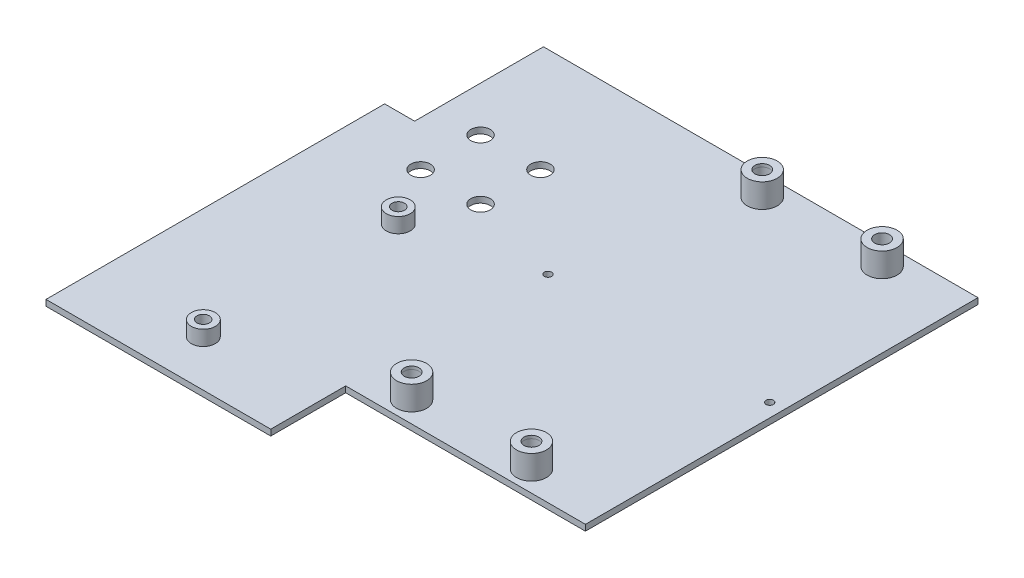
ISO-10303-21;
HEADER;
FILE_DESCRIPTION(('STEP AP214'),'2;1');
FILE_NAME('part.step','',(''),(''),'','','');
FILE_SCHEMA(('AUTOMOTIVE_DESIGN { 1 0 10303 214 1 1 1 1 }'));
ENDSEC;
DATA;
#1=APPLICATION_CONTEXT('core data for automotive mechanical design processes');
#2=APPLICATION_PROTOCOL_DEFINITION('international standard','automotive_design',2000,#1);
#3=PRODUCT_CONTEXT('',#1,'mechanical');
#4=PRODUCT('Part','Part','',(#3));
#5=PRODUCT_RELATED_PRODUCT_CATEGORY('part','',(#4));
#6=PRODUCT_DEFINITION_FORMATION('','',#4);
#7=PRODUCT_DEFINITION_CONTEXT('part definition',#1,'design');
#8=PRODUCT_DEFINITION('design','',#6,#7);
#9=PRODUCT_DEFINITION_SHAPE('','',#8);
#10=(LENGTH_UNIT() NAMED_UNIT(*) SI_UNIT(.MILLI.,.METRE.));
#11=(NAMED_UNIT(*) PLANE_ANGLE_UNIT() SI_UNIT($,.RADIAN.));
#12=(NAMED_UNIT(*) SI_UNIT($,.STERADIAN.) SOLID_ANGLE_UNIT());
#13=UNCERTAINTY_MEASURE_WITH_UNIT(LENGTH_MEASURE(1.E-05),#10,'distance_accuracy_value','');
#14=(GEOMETRIC_REPRESENTATION_CONTEXT(3) GLOBAL_UNCERTAINTY_ASSIGNED_CONTEXT((#13)) GLOBAL_UNIT_ASSIGNED_CONTEXT((#10,
#11,#12)) REPRESENTATION_CONTEXT('',''));
#15=CARTESIAN_POINT('',(0.,0.,0.));
#16=DIRECTION('',(0.,0.,1.));
#17=DIRECTION('',(1.,0.,0.));
#18=AXIS2_PLACEMENT_3D('',#15,#16,#17);
#19=CARTESIAN_POINT('',(90.,2.,-50.));
#20=DIRECTION('',(1.,0.,0.));
#21=DIRECTION('',(0.,0.,-1.));
#22=AXIS2_PLACEMENT_3D('',#19,#20,#21);
#23=PLANE('',#22);
#24=DIRECTION('',(0.,0.,1.));
#25=VECTOR('',#24,1.);
#26=CARTESIAN_POINT('',(90.,2.,-50.));
#27=LINE('',#26,#25);
#28=CARTESIAN_POINT('',(90.,2.,-66.));
#29=VERTEX_POINT('',#28);
#30=CARTESIAN_POINT('',(90.,2.,65.));
#31=VERTEX_POINT('',#30);
#32=EDGE_CURVE('E122',#29,#31,#27,.T.);
#33=ORIENTED_EDGE('',*,*,#32,.T.);
#34=DIRECTION('',(0.,-1.,0.));
#35=VECTOR('',#34,1.);
#36=CARTESIAN_POINT('',(90.,47.3659563319489,65.));
#37=LINE('',#36,#35);
#38=CARTESIAN_POINT('',(90.,0.,65.));
#39=VERTEX_POINT('',#38);
#40=EDGE_CURVE('E39',#31,#39,#37,.T.);
#41=ORIENTED_EDGE('',*,*,#40,.T.);
#42=DIRECTION('',(0.,0.,1.));
#43=VECTOR('',#42,1.);
#44=CARTESIAN_POINT('',(90.,0.,-50.));
#45=LINE('',#44,#43);
#46=CARTESIAN_POINT('',(90.,0.,-66.));
#47=VERTEX_POINT('',#46);
#48=EDGE_CURVE('E97',#47,#39,#45,.T.);
#49=ORIENTED_EDGE('',*,*,#48,.F.);
#50=DIRECTION('',(0.,-1.,0.));
#51=VECTOR('',#50,1.);
#52=CARTESIAN_POINT('',(90.,2.,-66.));
#53=LINE('',#52,#51);
#54=EDGE_CURVE('E102',#29,#47,#53,.T.);
#55=ORIENTED_EDGE('',*,*,#54,.F.);
#56=EDGE_LOOP('',(#33,#41,#49,#55));
#57=FACE_BOUND('',#56,.T.);
#58=ADVANCED_FACE('F20',(#57),#23,.T.);
#59=CARTESIAN_POINT('',(65.,27.5440719376556,58.));
#60=DIRECTION('',(0.,-1.,0.));
#61=DIRECTION('',(0.,0.,-1.));
#62=AXIS2_PLACEMENT_3D('',#59,#60,#61);
#63=CYLINDRICAL_SURFACE('',#62,2.4585);
#64=CARTESIAN_POINT('',(65.,10.,58.));
#65=DIRECTION('',(0.,-1.,0.));
#66=DIRECTION('',(0.,0.,-1.));
#67=AXIS2_PLACEMENT_3D('',#64,#65,#66);
#68=CIRCLE('',#67,2.4585);
#69=CARTESIAN_POINT('',(65.,10.,55.5415));
#70=VERTEX_POINT('',#69);
#71=EDGE_CURVE('E133',#70,#70,#68,.F.);
#72=ORIENTED_EDGE('',*,*,#71,.T.);
#73=EDGE_LOOP('',(#72));
#74=FACE_BOUND('',#73,.T.);
#75=CARTESIAN_POINT('',(65.,9.,58.));
#76=DIRECTION('',(0.,-1.,0.));
#77=DIRECTION('',(0.,0.,-1.));
#78=AXIS2_PLACEMENT_3D('',#75,#76,#77);
#79=CIRCLE('',#78,2.4585);
#80=CARTESIAN_POINT('',(65.,9.,55.5415));
#81=VERTEX_POINT('',#80);
#82=EDGE_CURVE('E197',#81,#81,#79,.T.);
#83=ORIENTED_EDGE('',*,*,#82,.T.);
#84=EDGE_LOOP('',(#83));
#85=FACE_BOUND('',#84,.T.);
#86=ADVANCED_FACE('F374',(#74,#85),#63,.F.);
#87=CARTESIAN_POINT('',(25.,27.5440719376556,58.));
#88=DIRECTION('',(0.,-1.,0.));
#89=DIRECTION('',(0.,0.,-1.));
#90=AXIS2_PLACEMENT_3D('',#87,#88,#89);
#91=CYLINDRICAL_SURFACE('',#90,2.4585);
#92=CARTESIAN_POINT('',(25.,10.,58.));
#93=DIRECTION('',(0.,-1.,0.));
#94=DIRECTION('',(0.,0.,-1.));
#95=AXIS2_PLACEMENT_3D('',#92,#93,#94);
#96=CIRCLE('',#95,2.4585);
#97=CARTESIAN_POINT('',(25.,10.,55.5415));
#98=VERTEX_POINT('',#97);
#99=EDGE_CURVE('E171',#98,#98,#96,.F.);
#100=ORIENTED_EDGE('',*,*,#99,.T.);
#101=EDGE_LOOP('',(#100));
#102=FACE_BOUND('',#101,.T.);
#103=CARTESIAN_POINT('',(25.,9.,58.));
#104=DIRECTION('',(0.,-1.,0.));
#105=DIRECTION('',(0.,0.,-1.));
#106=AXIS2_PLACEMENT_3D('',#103,#104,#105);
#107=CIRCLE('',#106,2.4585);
#108=CARTESIAN_POINT('',(25.,9.,55.5415));
#109=VERTEX_POINT('',#108);
#110=EDGE_CURVE('E167',#109,#109,#107,.T.);
#111=ORIENTED_EDGE('',*,*,#110,.T.);
#112=EDGE_LOOP('',(#111));
#113=FACE_BOUND('',#112,.T.);
#114=ADVANCED_FACE('F379',(#102,#113),#91,.F.);
#115=CARTESIAN_POINT('',(65.,27.5440719376556,-59.));
#116=DIRECTION('',(0.,-1.,0.));
#117=DIRECTION('',(0.,0.,-1.));
#118=AXIS2_PLACEMENT_3D('',#115,#116,#117);
#119=CYLINDRICAL_SURFACE('',#118,2.4585);
#120=CARTESIAN_POINT('',(65.,0.,-59.));
#121=DIRECTION('',(0.,-1.,0.));
#122=DIRECTION('',(0.,0.,-1.));
#123=AXIS2_PLACEMENT_3D('',#120,#121,#122);
#124=CIRCLE('',#123,2.4585);
#125=CARTESIAN_POINT('',(65.,0.,-61.4585));
#126=VERTEX_POINT('',#125);
#127=EDGE_CURVE('E142',#126,#126,#124,.F.);
#128=ORIENTED_EDGE('',*,*,#127,.F.);
#129=EDGE_LOOP('',(#128));
#130=FACE_BOUND('',#129,.T.);
#131=CARTESIAN_POINT('',(65.,1.,-59.));
#132=DIRECTION('',(0.,1.,0.));
#133=DIRECTION('',(0.,0.,-1.));
#134=AXIS2_PLACEMENT_3D('',#131,#132,#133);
#135=CIRCLE('',#134,2.4585);
#136=CARTESIAN_POINT('',(65.,1.,-61.4585));
#137=VERTEX_POINT('',#136);
#138=EDGE_CURVE('E161',#137,#137,#135,.T.);
#139=ORIENTED_EDGE('',*,*,#138,.T.);
#140=EDGE_LOOP('',(#139));
#141=FACE_BOUND('',#140,.T.);
#142=ADVANCED_FACE('F396',(#130,#141),#119,.F.);
#143=CARTESIAN_POINT('',(25.,27.5440719376556,-59.));
#144=DIRECTION('',(0.,-1.,0.));
#145=DIRECTION('',(0.,0.,-1.));
#146=AXIS2_PLACEMENT_3D('',#143,#144,#145);
#147=CYLINDRICAL_SURFACE('',#146,2.4585);
#148=CARTESIAN_POINT('',(25.,10.,-59.));
#149=DIRECTION('',(0.,-1.,0.));
#150=DIRECTION('',(0.,0.,-1.));
#151=AXIS2_PLACEMENT_3D('',#148,#149,#150);
#152=CIRCLE('',#151,2.4585);
#153=CARTESIAN_POINT('',(25.,10.,-61.4585));
#154=VERTEX_POINT('',#153);
#155=EDGE_CURVE('E137',#154,#154,#152,.F.);
#156=ORIENTED_EDGE('',*,*,#155,.T.);
#157=EDGE_LOOP('',(#156));
#158=FACE_BOUND('',#157,.T.);
#159=CARTESIAN_POINT('',(25.,9.,-59.));
#160=DIRECTION('',(0.,-1.,0.));
#161=DIRECTION('',(0.,0.,-1.));
#162=AXIS2_PLACEMENT_3D('',#159,#160,#161);
#163=CIRCLE('',#162,2.4585);
#164=CARTESIAN_POINT('',(25.,9.,-61.4585));
#165=VERTEX_POINT('',#164);
#166=EDGE_CURVE('E157',#165,#165,#163,.T.);
#167=ORIENTED_EDGE('',*,*,#166,.T.);
#168=EDGE_LOOP('',(#167));
#169=FACE_BOUND('',#168,.T.);
#170=ADVANCED_FACE('F391',(#158,#169),#147,.F.);
#171=CARTESIAN_POINT('',(-28.,47.1871181512282,74.55));
#172=DIRECTION('',(0.,-1.,0.));
#173=DIRECTION('',(0.,0.,-1.));
#174=AXIS2_PLACEMENT_3D('',#171,#172,#173);
#175=CYLINDRICAL_SURFACE('',#174,2.067);
#176=CARTESIAN_POINT('',(-28.,0.,74.55));
#177=DIRECTION('',(0.,-1.,0.));
#178=DIRECTION('',(0.,0.,-1.));
#179=AXIS2_PLACEMENT_3D('',#176,#177,#178);
#180=CIRCLE('',#179,2.067);
#181=CARTESIAN_POINT('',(-28.,0.,72.483));
#182=VERTEX_POINT('',#181);
#183=EDGE_CURVE('E262',#182,#182,#180,.F.);
#184=ORIENTED_EDGE('',*,*,#183,.F.);
#185=EDGE_LOOP('',(#184));
#186=FACE_BOUND('',#185,.T.);
#187=CARTESIAN_POINT('',(-28.,7.,74.55));
#188=DIRECTION('',(0.,-1.,0.));
#189=DIRECTION('',(0.,0.,-1.));
#190=AXIS2_PLACEMENT_3D('',#187,#188,#189);
#191=CIRCLE('',#190,2.067);
#192=CARTESIAN_POINT('',(-28.,7.,72.483));
#193=VERTEX_POINT('',#192);
#194=EDGE_CURVE('E266',#193,#193,#191,.F.);
#195=ORIENTED_EDGE('',*,*,#194,.T.);
#196=EDGE_LOOP('',(#195));
#197=FACE_BOUND('',#196,.T.);
#198=ADVANCED_FACE('F454',(#186,#197),#175,.F.);
#199=CARTESIAN_POINT('',(0.,0.,0.));
#200=DIRECTION('',(0.,-1.,0.));
#201=DIRECTION('',(0.,0.,-1.));
#202=AXIS2_PLACEMENT_3D('',#199,#200,#201);
#203=PLANE('',#202);
#204=DIRECTION('',(0.,0.,-1.));
#205=VECTOR('',#204,1.);
#206=CARTESIAN_POINT('',(10.,0.,90.));
#207=LINE('',#206,#205);
#208=CARTESIAN_POINT('',(10.,0.,90.));
#209=VERTEX_POINT('',#208);
#210=CARTESIAN_POINT('',(10.,0.,65.));
#211=VERTEX_POINT('',#210);
#212=EDGE_CURVE('E346',#209,#211,#207,.T.);
#213=ORIENTED_EDGE('',*,*,#212,.F.);
#214=DIRECTION('',(-1.,0.,0.));
#215=VECTOR('',#214,1.);
#216=CARTESIAN_POINT('',(50.,0.,90.));
#217=LINE('',#216,#215);
#218=CARTESIAN_POINT('',(-65.,0.,90.));
#219=VERTEX_POINT('',#218);
#220=EDGE_CURVE('E111',#209,#219,#217,.T.);
#221=ORIENTED_EDGE('',*,*,#220,.T.);
#222=DIRECTION('',(0.,0.,1.));
#223=VECTOR('',#222,1.);
#224=CARTESIAN_POINT('',(-65.,0.,50.));
#225=LINE('',#224,#223);
#226=CARTESIAN_POINT('',(-65.,0.,-23.));
#227=VERTEX_POINT('',#226);
#228=EDGE_CURVE('E100',#219,#227,#225,.F.);
#229=ORIENTED_EDGE('',*,*,#228,.T.);
#230=DIRECTION('',(-1.,0.,0.));
#231=VECTOR('',#230,1.);
#232=CARTESIAN_POINT('',(-50.,0.,-23.));
#233=LINE('',#232,#231);
#234=CARTESIAN_POINT('',(-55.,0.,-23.));
#235=VERTEX_POINT('',#234);
#236=EDGE_CURVE('E221',#235,#227,#233,.T.);
#237=ORIENTED_EDGE('',*,*,#236,.F.);
#238=DIRECTION('',(0.,0.,-1.));
#239=VECTOR('',#238,1.);
#240=CARTESIAN_POINT('',(-55.,0.,-66.));
#241=LINE('',#240,#239);
#242=CARTESIAN_POINT('',(-55.,0.,-66.));
#243=VERTEX_POINT('',#242);
#244=EDGE_CURVE('E58',#235,#243,#241,.T.);
#245=ORIENTED_EDGE('',*,*,#244,.T.);
#246=DIRECTION('',(1.,0.,0.));
#247=VECTOR('',#246,1.);
#248=CARTESIAN_POINT('',(-50.,0.,-66.));
#249=LINE('',#248,#247);
#250=EDGE_CURVE('E91',#243,#47,#249,.T.);
#251=ORIENTED_EDGE('',*,*,#250,.T.);
#252=ORIENTED_EDGE('',*,*,#48,.T.);
#253=DIRECTION('',(1.,0.,0.));
#254=VECTOR('',#253,1.);
#255=CARTESIAN_POINT('',(10.,0.,65.));
#256=LINE('',#255,#254);
#257=EDGE_CURVE('E343',#211,#39,#256,.T.);
#258=ORIENTED_EDGE('',*,*,#257,.F.);
#259=EDGE_LOOP('',(#213,#221,#229,#237,#245,#251,#252,#258));
#260=FACE_BOUND('',#259,.T.);
#261=CARTESIAN_POINT('',(11.5,0.,-1.));
#262=DIRECTION('',(0.,-1.,0.));
#263=DIRECTION('',(0.,0.,-1.));
#264=AXIS2_PLACEMENT_3D('',#261,#262,#263);
#265=CIRCLE('',#264,1.2295);
#266=CARTESIAN_POINT('',(11.5,0.,-2.2295));
#267=VERTEX_POINT('',#266);
#268=EDGE_CURVE('E202',#267,#267,#265,.F.);
#269=ORIENTED_EDGE('',*,*,#268,.T.);
#270=EDGE_LOOP('',(#269));
#271=FACE_BOUND('',#270,.T.);
#272=CARTESIAN_POINT('',(85.5,0.,-1.));
#273=DIRECTION('',(0.,-1.,0.));
#274=DIRECTION('',(0.,0.,-1.));
#275=AXIS2_PLACEMENT_3D('',#272,#273,#274);
#276=CIRCLE('',#275,1.2295);
#277=CARTESIAN_POINT('',(85.5,0.,-2.2295));
#278=VERTEX_POINT('',#277);
#279=EDGE_CURVE('E210',#278,#278,#276,.F.);
#280=ORIENTED_EDGE('',*,*,#279,.T.);
#281=EDGE_LOOP('',(#280));
#282=FACE_BOUND('',#281,.T.);
#283=CARTESIAN_POINT('',(65.,0.,58.));
#284=DIRECTION('',(0.,-1.,0.));
#285=DIRECTION('',(0.,0.,-1.));
#286=AXIS2_PLACEMENT_3D('',#283,#284,#285);
#287=CIRCLE('',#286,2.4585);
#288=CARTESIAN_POINT('',(65.,0.,55.5415));
#289=VERTEX_POINT('',#288);
#290=EDGE_CURVE('E156',#289,#289,#287,.F.);
#291=ORIENTED_EDGE('',*,*,#290,.T.);
#292=EDGE_LOOP('',(#291));
#293=FACE_BOUND('',#292,.T.);
#294=CARTESIAN_POINT('',(25.,0.,58.));
#295=DIRECTION('',(0.,-1.,0.));
#296=DIRECTION('',(0.,0.,-1.));
#297=AXIS2_PLACEMENT_3D('',#294,#295,#296);
#298=CIRCLE('',#297,2.4585);
#299=CARTESIAN_POINT('',(25.,0.,55.5415));
#300=VERTEX_POINT('',#299);
#301=EDGE_CURVE('E153',#300,#300,#298,.F.);
#302=ORIENTED_EDGE('',*,*,#301,.T.);
#303=EDGE_LOOP('',(#302));
#304=FACE_BOUND('',#303,.T.);
#305=CARTESIAN_POINT('',(25.,0.,-59.));
#306=DIRECTION('',(0.,-1.,0.));
#307=DIRECTION('',(0.,0.,-1.));
#308=AXIS2_PLACEMENT_3D('',#305,#306,#307);
#309=CIRCLE('',#308,2.4585);
#310=CARTESIAN_POINT('',(25.,0.,-61.4585));
#311=VERTEX_POINT('',#310);
#312=EDGE_CURVE('E147',#311,#311,#309,.F.);
#313=ORIENTED_EDGE('',*,*,#312,.T.);
#314=EDGE_LOOP('',(#313));
#315=FACE_BOUND('',#314,.T.);
#316=ORIENTED_EDGE('',*,*,#127,.T.);
#317=EDGE_LOOP('',(#316));
#318=FACE_BOUND('',#317,.T.);
#319=ORIENTED_EDGE('',*,*,#183,.T.);
#320=EDGE_LOOP('',(#319));
#321=FACE_BOUND('',#320,.T.);
#322=CARTESIAN_POINT('',(-28.,0.,9.45));
#323=DIRECTION('',(0.,-1.,0.));
#324=DIRECTION('',(0.,0.,-1.));
#325=AXIS2_PLACEMENT_3D('',#322,#323,#324);
#326=CIRCLE('',#325,2.067);
#327=CARTESIAN_POINT('',(-28.,0.,7.383));
#328=VERTEX_POINT('',#327);
#329=EDGE_CURVE('E230',#328,#328,#326,.F.);
#330=ORIENTED_EDGE('',*,*,#329,.T.);
#331=EDGE_LOOP('',(#330));
#332=FACE_BOUND('',#331,.T.);
#333=CARTESIAN_POINT('',(-20.,0.,-30.));
#334=DIRECTION('',(0.,1.,0.));
#335=DIRECTION('',(1.,0.,0.));
#336=AXIS2_PLACEMENT_3D('',#333,#334,#335);
#337=CIRCLE('',#336,3.25);
#338=CARTESIAN_POINT('',(-16.75,0.,-30.));
#339=VERTEX_POINT('',#338);
#340=EDGE_CURVE('E225',#339,#339,#337,.T.);
#341=ORIENTED_EDGE('',*,*,#340,.T.);
#342=EDGE_LOOP('',(#341));
#343=FACE_BOUND('',#342,.T.);
#344=CARTESIAN_POINT('',(-40.,0.,-30.));
#345=DIRECTION('',(0.,1.,0.));
#346=DIRECTION('',(1.,0.,0.));
#347=AXIS2_PLACEMENT_3D('',#344,#345,#346);
#348=CIRCLE('',#347,3.25);
#349=CARTESIAN_POINT('',(-36.75,0.,-30.));
#350=VERTEX_POINT('',#349);
#351=EDGE_CURVE('E233',#350,#350,#348,.T.);
#352=ORIENTED_EDGE('',*,*,#351,.T.);
#353=EDGE_LOOP('',(#352));
#354=FACE_BOUND('',#353,.T.);
#355=CARTESIAN_POINT('',(-20.,0.,-10.));
#356=DIRECTION('',(0.,1.,0.));
#357=DIRECTION('',(1.,0.,0.));
#358=AXIS2_PLACEMENT_3D('',#355,#356,#357);
#359=CIRCLE('',#358,3.25);
#360=CARTESIAN_POINT('',(-16.75,0.,-10.));
#361=VERTEX_POINT('',#360);
#362=EDGE_CURVE('E234',#361,#361,#359,.T.);
#363=ORIENTED_EDGE('',*,*,#362,.T.);
#364=EDGE_LOOP('',(#363));
#365=FACE_BOUND('',#364,.T.);
#366=CARTESIAN_POINT('',(-40.,0.,-10.));
#367=DIRECTION('',(0.,1.,0.));
#368=DIRECTION('',(1.,0.,0.));
#369=AXIS2_PLACEMENT_3D('',#366,#367,#368);
#370=CIRCLE('',#369,3.25);
#371=CARTESIAN_POINT('',(-36.75,0.,-10.));
#372=VERTEX_POINT('',#371);
#373=EDGE_CURVE('E242',#372,#372,#370,.T.);
#374=ORIENTED_EDGE('',*,*,#373,.T.);
#375=EDGE_LOOP('',(#374));
#376=FACE_BOUND('',#375,.T.);
#377=ADVANCED_FACE('F93',(#260,#271,#282,#293,#304,#315,#318,#321,#332,#343,#354,#365,#376),
#203,.T.);
#378=CARTESIAN_POINT('',(-50.,2.,-66.));
#379=DIRECTION('',(0.,0.,-1.));
#380=DIRECTION('',(-1.,0.,0.));
#381=AXIS2_PLACEMENT_3D('',#378,#379,#380);
#382=PLANE('',#381);
#383=ORIENTED_EDGE('',*,*,#250,.F.);
#384=DIRECTION('',(0.,-1.,0.));
#385=VECTOR('',#384,1.);
#386=CARTESIAN_POINT('',(-55.,16.6979131098016,-66.));
#387=LINE('',#386,#385);
#388=CARTESIAN_POINT('',(-55.,2.,-66.));
#389=VERTEX_POINT('',#388);
#390=EDGE_CURVE('E188',#389,#243,#387,.T.);
#391=ORIENTED_EDGE('',*,*,#390,.F.);
#392=DIRECTION('',(1.,0.,0.));
#393=VECTOR('',#392,1.);
#394=CARTESIAN_POINT('',(-50.,2.,-66.));
#395=LINE('',#394,#393);
#396=EDGE_CURVE('E85',#389,#29,#395,.T.);
#397=ORIENTED_EDGE('',*,*,#396,.T.);
#398=ORIENTED_EDGE('',*,*,#54,.T.);
#399=EDGE_LOOP('',(#383,#391,#397,#398));
#400=FACE_BOUND('',#399,.T.);
#401=ADVANCED_FACE('F103',(#400),#382,.T.);
#402=CARTESIAN_POINT('',(0.,2.,0.));
#403=DIRECTION('',(0.,-1.,0.));
#404=DIRECTION('',(0.,0.,-1.));
#405=AXIS2_PLACEMENT_3D('',#402,#403,#404);
#406=PLANE('',#405);
#407=CARTESIAN_POINT('',(11.5,2.,-1.));
#408=DIRECTION('',(0.,-1.,0.));
#409=DIRECTION('',(0.,0.,-1.));
#410=AXIS2_PLACEMENT_3D('',#407,#408,#409);
#411=CIRCLE('',#410,1.2295);
#412=CARTESIAN_POINT('',(11.5,2.,-2.2295));
#413=VERTEX_POINT('',#412);
#414=EDGE_CURVE('E206',#413,#413,#411,.F.);
#415=ORIENTED_EDGE('',*,*,#414,.F.);
#416=EDGE_LOOP('',(#415));
#417=FACE_BOUND('',#416,.T.);
#418=CARTESIAN_POINT('',(85.5,2.,-1.));
#419=DIRECTION('',(0.,-1.,0.));
#420=DIRECTION('',(0.,0.,-1.));
#421=AXIS2_PLACEMENT_3D('',#418,#419,#420);
#422=CIRCLE('',#421,1.2295);
#423=CARTESIAN_POINT('',(85.5,2.,-2.2295));
#424=VERTEX_POINT('',#423);
#425=EDGE_CURVE('E214',#424,#424,#422,.F.);
#426=ORIENTED_EDGE('',*,*,#425,.F.);
#427=EDGE_LOOP('',(#426));
#428=FACE_BOUND('',#427,.T.);
#429=CARTESIAN_POINT('',(-27.9447256614999,2.,74.55));
#430=DIRECTION('',(0.,-1.,0.));
#431=DIRECTION('',(-1.,0.,0.));
#432=AXIS2_PLACEMENT_3D('',#429,#430,#431);
#433=CIRCLE('',#432,4.);
#434=CARTESIAN_POINT('',(-31.9447256614999,2.,74.55));
#435=VERTEX_POINT('',#434);
#436=EDGE_CURVE('E146',#435,#435,#433,.T.);
#437=ORIENTED_EDGE('',*,*,#436,.T.);
#438=EDGE_LOOP('',(#437));
#439=FACE_BOUND('',#438,.T.);
#440=CARTESIAN_POINT('',(-40.,2.,-10.));
#441=DIRECTION('',(0.,-1.,0.));
#442=DIRECTION('',(0.,0.,-1.));
#443=AXIS2_PLACEMENT_3D('',#440,#441,#442);
#444=CIRCLE('',#443,3.25);
#445=CARTESIAN_POINT('',(-40.,2.,-13.25));
#446=VERTEX_POINT('',#445);
#447=EDGE_CURVE('E24',#446,#446,#444,.F.);
#448=ORIENTED_EDGE('',*,*,#447,.F.);
#449=EDGE_LOOP('',(#448));
#450=FACE_BOUND('',#449,.T.);
#451=CARTESIAN_POINT('',(-20.,2.,-10.));
#452=DIRECTION('',(0.,-1.,0.));
#453=DIRECTION('',(0.,0.,-1.));
#454=AXIS2_PLACEMENT_3D('',#451,#452,#453);
#455=CIRCLE('',#454,3.25);
#456=CARTESIAN_POINT('',(-20.,2.,-13.25));
#457=VERTEX_POINT('',#456);
#458=EDGE_CURVE('E238',#457,#457,#455,.F.);
#459=ORIENTED_EDGE('',*,*,#458,.F.);
#460=EDGE_LOOP('',(#459));
#461=FACE_BOUND('',#460,.T.);
#462=CARTESIAN_POINT('',(-40.,2.,-30.));
#463=DIRECTION('',(0.,-1.,0.));
#464=DIRECTION('',(0.,0.,-1.));
#465=AXIS2_PLACEMENT_3D('',#462,#463,#464);
#466=CIRCLE('',#465,3.25);
#467=CARTESIAN_POINT('',(-40.,2.,-33.25));
#468=VERTEX_POINT('',#467);
#469=EDGE_CURVE('E239',#468,#468,#466,.F.);
#470=ORIENTED_EDGE('',*,*,#469,.F.);
#471=EDGE_LOOP('',(#470));
#472=FACE_BOUND('',#471,.T.);
#473=CARTESIAN_POINT('',(-20.,2.,-30.));
#474=DIRECTION('',(0.,-1.,0.));
#475=DIRECTION('',(0.,0.,-1.));
#476=AXIS2_PLACEMENT_3D('',#473,#474,#475);
#477=CIRCLE('',#476,3.25);
#478=CARTESIAN_POINT('',(-20.,2.,-33.25));
#479=VERTEX_POINT('',#478);
#480=EDGE_CURVE('E229',#479,#479,#477,.F.);
#481=ORIENTED_EDGE('',*,*,#480,.F.);
#482=EDGE_LOOP('',(#481));
#483=FACE_BOUND('',#482,.T.);
#484=CARTESIAN_POINT('',(-28.,2.,9.45));
#485=DIRECTION('',(0.,-1.,0.));
#486=DIRECTION('',(-1.,0.,0.));
#487=AXIS2_PLACEMENT_3D('',#484,#485,#486);
#488=CIRCLE('',#487,4.);
#489=CARTESIAN_POINT('',(-32.,2.,9.45));
#490=VERTEX_POINT('',#489);
#491=EDGE_CURVE('E269',#490,#490,#488,.T.);
#492=ORIENTED_EDGE('',*,*,#491,.T.);
#493=EDGE_LOOP('',(#492));
#494=FACE_BOUND('',#493,.T.);
#495=CARTESIAN_POINT('',(25.,2.,-59.));
#496=DIRECTION('',(0.,-1.,0.));
#497=DIRECTION('',(-1.,0.,0.));
#498=AXIS2_PLACEMENT_3D('',#495,#496,#497);
#499=CIRCLE('',#498,5.);
#500=CARTESIAN_POINT('',(20.,2.,-59.));
#501=VERTEX_POINT('',#500);
#502=EDGE_CURVE('E138',#501,#501,#499,.T.);
#503=ORIENTED_EDGE('',*,*,#502,.T.);
#504=EDGE_LOOP('',(#503));
#505=FACE_BOUND('',#504,.T.);
#506=CARTESIAN_POINT('',(65.,2.,-59.));
#507=DIRECTION('',(0.,-1.,0.));
#508=DIRECTION('',(-1.,0.,0.));
#509=AXIS2_PLACEMENT_3D('',#506,#507,#508);
#510=CIRCLE('',#509,5.);
#511=CARTESIAN_POINT('',(60.,2.,-59.));
#512=VERTEX_POINT('',#511);
#513=EDGE_CURVE('E129',#512,#512,#510,.T.);
#514=ORIENTED_EDGE('',*,*,#513,.T.);
#515=EDGE_LOOP('',(#514));
#516=FACE_BOUND('',#515,.T.);
#517=CARTESIAN_POINT('',(65.,2.,58.));
#518=DIRECTION('',(0.,-1.,0.));
#519=DIRECTION('',(-1.,0.,0.));
#520=AXIS2_PLACEMENT_3D('',#517,#518,#519);
#521=CIRCLE('',#520,5.);
#522=CARTESIAN_POINT('',(60.,2.,58.));
#523=VERTEX_POINT('',#522);
#524=EDGE_CURVE('E174',#523,#523,#521,.T.);
#525=ORIENTED_EDGE('',*,*,#524,.T.);
#526=EDGE_LOOP('',(#525));
#527=FACE_BOUND('',#526,.T.);
#528=CARTESIAN_POINT('',(25.,2.,58.));
#529=DIRECTION('',(0.,-1.,0.));
#530=DIRECTION('',(-1.,0.,0.));
#531=AXIS2_PLACEMENT_3D('',#528,#529,#530);
#532=CIRCLE('',#531,5.);
#533=CARTESIAN_POINT('',(20.,2.,58.));
#534=VERTEX_POINT('',#533);
#535=EDGE_CURVE('E184',#534,#534,#532,.T.);
#536=ORIENTED_EDGE('',*,*,#535,.T.);
#537=EDGE_LOOP('',(#536));
#538=FACE_BOUND('',#537,.T.);
#539=DIRECTION('',(-1.,0.,0.));
#540=VECTOR('',#539,1.);
#541=CARTESIAN_POINT('',(50.,2.,90.));
#542=LINE('',#541,#540);
#543=CARTESIAN_POINT('',(10.,2.,90.));
#544=VERTEX_POINT('',#543);
#545=CARTESIAN_POINT('',(-65.,2.,90.));
#546=VERTEX_POINT('',#545);
#547=EDGE_CURVE('E123',#544,#546,#542,.T.);
#548=ORIENTED_EDGE('',*,*,#547,.F.);
#549=DIRECTION('',(0.,0.,-1.));
#550=VECTOR('',#549,1.);
#551=CARTESIAN_POINT('',(10.,2.,0.));
#552=LINE('',#551,#550);
#553=CARTESIAN_POINT('',(10.,2.,65.));
#554=VERTEX_POINT('',#553);
#555=EDGE_CURVE('E12',#544,#554,#552,.T.);
#556=ORIENTED_EDGE('',*,*,#555,.T.);
#557=DIRECTION('',(1.,0.,0.));
#558=VECTOR('',#557,1.);
#559=CARTESIAN_POINT('',(0.,2.,65.));
#560=LINE('',#559,#558);
#561=EDGE_CURVE('E30',#554,#31,#560,.T.);
#562=ORIENTED_EDGE('',*,*,#561,.T.);
#563=ORIENTED_EDGE('',*,*,#32,.F.);
#564=ORIENTED_EDGE('',*,*,#396,.F.);
#565=DIRECTION('',(0.,0.,-1.));
#566=VECTOR('',#565,1.);
#567=CARTESIAN_POINT('',(-55.,2.,0.));
#568=LINE('',#567,#566);
#569=CARTESIAN_POINT('',(-55.,2.,-23.));
#570=VERTEX_POINT('',#569);
#571=EDGE_CURVE('E107',#570,#389,#568,.T.);
#572=ORIENTED_EDGE('',*,*,#571,.F.);
#573=DIRECTION('',(-1.,0.,0.));
#574=VECTOR('',#573,1.);
#575=CARTESIAN_POINT('',(0.,2.,-23.));
#576=LINE('',#575,#574);
#577=CARTESIAN_POINT('',(-65.,2.,-23.));
#578=VERTEX_POINT('',#577);
#579=EDGE_CURVE('E207',#570,#578,#576,.T.);
#580=ORIENTED_EDGE('',*,*,#579,.T.);
#581=DIRECTION('',(0.,0.,-1.));
#582=VECTOR('',#581,1.);
#583=CARTESIAN_POINT('',(-65.,2.,50.));
#584=LINE('',#583,#582);
#585=EDGE_CURVE('E327',#546,#578,#584,.T.);
#586=ORIENTED_EDGE('',*,*,#585,.F.);
#587=EDGE_LOOP('',(#548,#556,#562,#563,#564,#572,#580,#586));
#588=FACE_BOUND('',#587,.T.);
#589=ADVANCED_FACE('F309',(#417,#428,#439,#450,#461,#472,#483,#494,#505,#516,#527,#538,#588),
#406,.F.);
#590=CARTESIAN_POINT('',(50.,2.,90.));
#591=DIRECTION('',(0.,0.,1.));
#592=DIRECTION('',(1.,0.,0.));
#593=AXIS2_PLACEMENT_3D('',#590,#591,#592);
#594=PLANE('',#593);
#595=DIRECTION('',(0.,-1.,0.));
#596=VECTOR('',#595,1.);
#597=CARTESIAN_POINT('',(10.,47.3659563319489,90.));
#598=LINE('',#597,#596);
#599=EDGE_CURVE('E337',#544,#209,#598,.T.);
#600=ORIENTED_EDGE('',*,*,#599,.F.);
#601=ORIENTED_EDGE('',*,*,#547,.T.);
#602=DIRECTION('',(0.,-1.,0.));
#603=VECTOR('',#602,1.);
#604=CARTESIAN_POINT('',(-65.,2.,90.));
#605=LINE('',#604,#603);
#606=EDGE_CURVE('E108',#546,#219,#605,.T.);
#607=ORIENTED_EDGE('',*,*,#606,.T.);
#608=ORIENTED_EDGE('',*,*,#220,.F.);
#609=EDGE_LOOP('',(#600,#601,#607,#608));
#610=FACE_BOUND('',#609,.T.);
#611=ADVANCED_FACE('F312',(#610),#594,.T.);
#612=CARTESIAN_POINT('',(-65.,2.,50.));
#613=DIRECTION('',(-1.,0.,0.));
#614=DIRECTION('',(0.,0.,1.));
#615=AXIS2_PLACEMENT_3D('',#612,#613,#614);
#616=PLANE('',#615);
#617=DIRECTION('',(0.,1.,0.));
#618=VECTOR('',#617,1.);
#619=CARTESIAN_POINT('',(-65.,2.,-23.));
#620=LINE('',#619,#618);
#621=EDGE_CURVE('E165',#227,#578,#620,.T.);
#622=ORIENTED_EDGE('',*,*,#621,.F.);
#623=ORIENTED_EDGE('',*,*,#228,.F.);
#624=ORIENTED_EDGE('',*,*,#606,.F.);
#625=ORIENTED_EDGE('',*,*,#585,.T.);
#626=EDGE_LOOP('',(#622,#623,#624,#625));
#627=FACE_BOUND('',#626,.T.);
#628=ADVANCED_FACE('F363',(#627),#616,.T.);
#629=CARTESIAN_POINT('',(-40.,18.055396746265,-10.));
#630=DIRECTION('',(0.,-1.,0.));
#631=DIRECTION('',(0.,0.,-1.));
#632=AXIS2_PLACEMENT_3D('',#629,#630,#631);
#633=CYLINDRICAL_SURFACE('',#632,3.25);
#634=ORIENTED_EDGE('',*,*,#373,.F.);
#635=EDGE_LOOP('',(#634));
#636=FACE_BOUND('',#635,.T.);
#637=ORIENTED_EDGE('',*,*,#447,.T.);
#638=EDGE_LOOP('',(#637));
#639=FACE_BOUND('',#638,.T.);
#640=ADVANCED_FACE('F370',(#636,#639),#633,.F.);
#641=CARTESIAN_POINT('',(-20.,18.055396746265,-10.));
#642=DIRECTION('',(0.,-1.,0.));
#643=DIRECTION('',(0.,0.,-1.));
#644=AXIS2_PLACEMENT_3D('',#641,#642,#643);
#645=CYLINDRICAL_SURFACE('',#644,3.25);
#646=ORIENTED_EDGE('',*,*,#362,.F.);
#647=EDGE_LOOP('',(#646));
#648=FACE_BOUND('',#647,.T.);
#649=ORIENTED_EDGE('',*,*,#458,.T.);
#650=EDGE_LOOP('',(#649));
#651=FACE_BOUND('',#650,.T.);
#652=ADVANCED_FACE('F22',(#648,#651),#645,.F.);
#653=CARTESIAN_POINT('',(-40.,18.055396746265,-30.));
#654=DIRECTION('',(0.,-1.,0.));
#655=DIRECTION('',(0.,0.,-1.));
#656=AXIS2_PLACEMENT_3D('',#653,#654,#655);
#657=CYLINDRICAL_SURFACE('',#656,3.25);
#658=ORIENTED_EDGE('',*,*,#351,.F.);
#659=EDGE_LOOP('',(#658));
#660=FACE_BOUND('',#659,.T.);
#661=ORIENTED_EDGE('',*,*,#469,.T.);
#662=EDGE_LOOP('',(#661));
#663=FACE_BOUND('',#662,.T.);
#664=ADVANCED_FACE('F434',(#660,#663),#657,.F.);
#665=CARTESIAN_POINT('',(-20.,18.055396746265,-30.));
#666=DIRECTION('',(0.,-1.,0.));
#667=DIRECTION('',(0.,0.,-1.));
#668=AXIS2_PLACEMENT_3D('',#665,#666,#667);
#669=CYLINDRICAL_SURFACE('',#668,3.25);
#670=ORIENTED_EDGE('',*,*,#340,.F.);
#671=EDGE_LOOP('',(#670));
#672=FACE_BOUND('',#671,.T.);
#673=ORIENTED_EDGE('',*,*,#480,.T.);
#674=EDGE_LOOP('',(#673));
#675=FACE_BOUND('',#674,.T.);
#676=ADVANCED_FACE('F292',(#672,#675),#669,.F.);
#677=CARTESIAN_POINT('',(-28.,47.1871181512282,9.45));
#678=DIRECTION('',(0.,-1.,0.));
#679=DIRECTION('',(0.,0.,-1.));
#680=AXIS2_PLACEMENT_3D('',#677,#678,#679);
#681=CYLINDRICAL_SURFACE('',#680,2.067);
#682=ORIENTED_EDGE('',*,*,#329,.F.);
#683=EDGE_LOOP('',(#682));
#684=FACE_BOUND('',#683,.T.);
#685=CARTESIAN_POINT('',(-28.,7.,9.45));
#686=DIRECTION('',(0.,-1.,0.));
#687=DIRECTION('',(0.,0.,-1.));
#688=AXIS2_PLACEMENT_3D('',#685,#686,#687);
#689=CIRCLE('',#688,2.067);
#690=CARTESIAN_POINT('',(-28.,7.,7.383));
#691=VERTEX_POINT('',#690);
#692=EDGE_CURVE('E120',#691,#691,#689,.F.);
#693=ORIENTED_EDGE('',*,*,#692,.T.);
#694=EDGE_LOOP('',(#693));
#695=FACE_BOUND('',#694,.T.);
#696=ADVANCED_FACE('F288',(#684,#695),#681,.F.);
#697=CARTESIAN_POINT('',(-28.,7.,9.45));
#698=DIRECTION('',(0.,-1.,0.));
#699=DIRECTION('',(0.,0.,-1.));
#700=AXIS2_PLACEMENT_3D('',#697,#698,#699);
#701=CYLINDRICAL_SURFACE('',#700,4.);
#702=CARTESIAN_POINT('',(-28.,7.,9.45));
#703=DIRECTION('',(0.,-1.,0.));
#704=DIRECTION('',(-1.,0.,0.));
#705=AXIS2_PLACEMENT_3D('',#702,#703,#704);
#706=CIRCLE('',#705,4.);
#707=CARTESIAN_POINT('',(-32.,7.,9.45));
#708=VERTEX_POINT('',#707);
#709=EDGE_CURVE('E271',#708,#708,#706,.T.);
#710=ORIENTED_EDGE('',*,*,#709,.T.);
#711=EDGE_LOOP('',(#710));
#712=FACE_BOUND('',#711,.T.);
#713=ORIENTED_EDGE('',*,*,#491,.F.);
#714=EDGE_LOOP('',(#713));
#715=FACE_BOUND('',#714,.T.);
#716=ADVANCED_FACE('F291',(#712,#715),#701,.T.);
#717=CARTESIAN_POINT('',(28.,7.,-40.55));
#718=DIRECTION('',(0.,-1.,0.));
#719=DIRECTION('',(0.,0.,-1.));
#720=AXIS2_PLACEMENT_3D('',#717,#718,#719);
#721=PLANE('',#720);
#722=ORIENTED_EDGE('',*,*,#692,.F.);
#723=EDGE_LOOP('',(#722));
#724=FACE_BOUND('',#723,.T.);
#725=ORIENTED_EDGE('',*,*,#709,.F.);
#726=EDGE_LOOP('',(#725));
#727=FACE_BOUND('',#726,.T.);
#728=ADVANCED_FACE('F297',(#724,#727),#721,.F.);
#729=CARTESIAN_POINT('',(-27.9447256614999,7.,74.55));
#730=DIRECTION('',(0.,-1.,0.));
#731=DIRECTION('',(0.,0.,-1.));
#732=AXIS2_PLACEMENT_3D('',#729,#730,#731);
#733=CYLINDRICAL_SURFACE('',#732,4.);
#734=CARTESIAN_POINT('',(-27.9447256614999,7.,74.55));
#735=DIRECTION('',(0.,-1.,0.));
#736=DIRECTION('',(-1.,0.,0.));
#737=AXIS2_PLACEMENT_3D('',#734,#735,#736);
#738=CIRCLE('',#737,4.);
#739=CARTESIAN_POINT('',(-31.9447256614999,7.,74.55));
#740=VERTEX_POINT('',#739);
#741=EDGE_CURVE('E270',#740,#740,#738,.T.);
#742=ORIENTED_EDGE('',*,*,#741,.T.);
#743=EDGE_LOOP('',(#742));
#744=FACE_BOUND('',#743,.T.);
#745=ORIENTED_EDGE('',*,*,#436,.F.);
#746=EDGE_LOOP('',(#745));
#747=FACE_BOUND('',#746,.T.);
#748=ADVANCED_FACE('F300',(#744,#747),#733,.T.);
#749=CARTESIAN_POINT('',(27.5552743385002,7.,24.55));
#750=DIRECTION('',(0.,-1.,0.));
#751=DIRECTION('',(0.,0.,-1.));
#752=AXIS2_PLACEMENT_3D('',#749,#750,#751);
#753=PLANE('',#752);
#754=ORIENTED_EDGE('',*,*,#194,.F.);
#755=EDGE_LOOP('',(#754));
#756=FACE_BOUND('',#755,.T.);
#757=ORIENTED_EDGE('',*,*,#741,.F.);
#758=EDGE_LOOP('',(#757));
#759=FACE_BOUND('',#758,.T.);
#760=ADVANCED_FACE('F394',(#756,#759),#753,.F.);
#761=ORIENTED_EDGE('',*,*,#138,.F.);
#762=EDGE_LOOP('',(#761));
#763=FACE_BOUND('',#762,.T.);
#764=CARTESIAN_POINT('',(65.,10.,-59.));
#765=DIRECTION('',(0.,-1.,0.));
#766=DIRECTION('',(0.,0.,-1.));
#767=AXIS2_PLACEMENT_3D('',#764,#765,#766);
#768=CIRCLE('',#767,2.4585);
#769=CARTESIAN_POINT('',(65.,10.,-61.4585));
#770=VERTEX_POINT('',#769);
#771=EDGE_CURVE('E128',#770,#770,#768,.F.);
#772=ORIENTED_EDGE('',*,*,#771,.T.);
#773=EDGE_LOOP('',(#772));
#774=FACE_BOUND('',#773,.T.);
#775=ADVANCED_FACE('F389',(#763,#774),#119,.F.);
#776=ORIENTED_EDGE('',*,*,#166,.F.);
#777=EDGE_LOOP('',(#776));
#778=FACE_BOUND('',#777,.T.);
#779=ORIENTED_EDGE('',*,*,#312,.F.);
#780=EDGE_LOOP('',(#779));
#781=FACE_BOUND('',#780,.T.);
#782=ADVANCED_FACE('F385',(#778,#781),#147,.F.);
#783=ORIENTED_EDGE('',*,*,#110,.F.);
#784=EDGE_LOOP('',(#783));
#785=FACE_BOUND('',#784,.T.);
#786=ORIENTED_EDGE('',*,*,#301,.F.);
#787=EDGE_LOOP('',(#786));
#788=FACE_BOUND('',#787,.T.);
#789=ADVANCED_FACE('F388',(#785,#788),#91,.F.);
#790=ORIENTED_EDGE('',*,*,#82,.F.);
#791=EDGE_LOOP('',(#790));
#792=FACE_BOUND('',#791,.T.);
#793=ORIENTED_EDGE('',*,*,#290,.F.);
#794=EDGE_LOOP('',(#793));
#795=FACE_BOUND('',#794,.T.);
#796=ADVANCED_FACE('F382',(#792,#795),#63,.F.);
#797=CARTESIAN_POINT('',(25.,10.,-59.));
#798=DIRECTION('',(0.,-1.,0.));
#799=DIRECTION('',(0.,0.,-1.));
#800=AXIS2_PLACEMENT_3D('',#797,#798,#799);
#801=CYLINDRICAL_SURFACE('',#800,5.);
#802=CARTESIAN_POINT('',(25.,10.,-59.));
#803=DIRECTION('',(0.,-1.,0.));
#804=DIRECTION('',(-1.,0.,0.));
#805=AXIS2_PLACEMENT_3D('',#802,#803,#804);
#806=CIRCLE('',#805,5.);
#807=CARTESIAN_POINT('',(20.,10.,-59.));
#808=VERTEX_POINT('',#807);
#809=EDGE_CURVE('E134',#808,#808,#806,.T.);
#810=ORIENTED_EDGE('',*,*,#809,.T.);
#811=EDGE_LOOP('',(#810));
#812=FACE_BOUND('',#811,.T.);
#813=ORIENTED_EDGE('',*,*,#502,.F.);
#814=EDGE_LOOP('',(#813));
#815=FACE_BOUND('',#814,.T.);
#816=ADVANCED_FACE('F397',(#812,#815),#801,.T.);
#817=CARTESIAN_POINT('',(15.,10.,-59.));
#818=DIRECTION('',(0.,-1.,0.));
#819=DIRECTION('',(0.,0.,-1.));
#820=AXIS2_PLACEMENT_3D('',#817,#818,#819);
#821=PLANE('',#820);
#822=ORIENTED_EDGE('',*,*,#155,.F.);
#823=EDGE_LOOP('',(#822));
#824=FACE_BOUND('',#823,.T.);
#825=ORIENTED_EDGE('',*,*,#809,.F.);
#826=EDGE_LOOP('',(#825));
#827=FACE_BOUND('',#826,.T.);
#828=ADVANCED_FACE('F400',(#824,#827),#821,.F.);
#829=CARTESIAN_POINT('',(65.,10.,-59.));
#830=DIRECTION('',(0.,-1.,0.));
#831=DIRECTION('',(0.,0.,-1.));
#832=AXIS2_PLACEMENT_3D('',#829,#830,#831);
#833=CYLINDRICAL_SURFACE('',#832,5.);
#834=CARTESIAN_POINT('',(65.,10.,-59.));
#835=DIRECTION('',(0.,-1.,0.));
#836=DIRECTION('',(-1.,0.,0.));
#837=AXIS2_PLACEMENT_3D('',#834,#835,#836);
#838=CIRCLE('',#837,5.);
#839=CARTESIAN_POINT('',(60.,10.,-59.));
#840=VERTEX_POINT('',#839);
#841=EDGE_CURVE('E125',#840,#840,#838,.T.);
#842=ORIENTED_EDGE('',*,*,#841,.T.);
#843=EDGE_LOOP('',(#842));
#844=FACE_BOUND('',#843,.T.);
#845=ORIENTED_EDGE('',*,*,#513,.F.);
#846=EDGE_LOOP('',(#845));
#847=FACE_BOUND('',#846,.T.);
#848=ADVANCED_FACE('F402',(#844,#847),#833,.T.);
#849=CARTESIAN_POINT('',(55.,10.,-59.));
#850=DIRECTION('',(0.,-1.,0.));
#851=DIRECTION('',(0.,0.,-1.));
#852=AXIS2_PLACEMENT_3D('',#849,#850,#851);
#853=PLANE('',#852);
#854=ORIENTED_EDGE('',*,*,#771,.F.);
#855=EDGE_LOOP('',(#854));
#856=FACE_BOUND('',#855,.T.);
#857=ORIENTED_EDGE('',*,*,#841,.F.);
#858=EDGE_LOOP('',(#857));
#859=FACE_BOUND('',#858,.T.);
#860=ADVANCED_FACE('F405',(#856,#859),#853,.F.);
#861=CARTESIAN_POINT('',(65.,10.,58.));
#862=DIRECTION('',(0.,-1.,0.));
#863=DIRECTION('',(0.,0.,-1.));
#864=AXIS2_PLACEMENT_3D('',#861,#862,#863);
#865=CYLINDRICAL_SURFACE('',#864,5.);
#866=CARTESIAN_POINT('',(65.,10.,58.));
#867=DIRECTION('',(0.,-1.,0.));
#868=DIRECTION('',(-1.,0.,0.));
#869=AXIS2_PLACEMENT_3D('',#866,#867,#868);
#870=CIRCLE('',#869,5.);
#871=CARTESIAN_POINT('',(60.,10.,58.));
#872=VERTEX_POINT('',#871);
#873=EDGE_CURVE('E176',#872,#872,#870,.T.);
#874=ORIENTED_EDGE('',*,*,#873,.T.);
#875=EDGE_LOOP('',(#874));
#876=FACE_BOUND('',#875,.T.);
#877=ORIENTED_EDGE('',*,*,#524,.F.);
#878=EDGE_LOOP('',(#877));
#879=FACE_BOUND('',#878,.T.);
#880=ADVANCED_FACE('F418',(#876,#879),#865,.T.);
#881=CARTESIAN_POINT('',(55.,10.,43.));
#882=DIRECTION('',(0.,-1.,0.));
#883=DIRECTION('',(0.,0.,-1.));
#884=AXIS2_PLACEMENT_3D('',#881,#882,#883);
#885=PLANE('',#884);
#886=ORIENTED_EDGE('',*,*,#71,.F.);
#887=EDGE_LOOP('',(#886));
#888=FACE_BOUND('',#887,.T.);
#889=ORIENTED_EDGE('',*,*,#873,.F.);
#890=EDGE_LOOP('',(#889));
#891=FACE_BOUND('',#890,.T.);
#892=ADVANCED_FACE('F416',(#888,#891),#885,.F.);
#893=CARTESIAN_POINT('',(25.,10.,58.));
#894=DIRECTION('',(0.,-1.,0.));
#895=DIRECTION('',(0.,0.,-1.));
#896=AXIS2_PLACEMENT_3D('',#893,#894,#895);
#897=CYLINDRICAL_SURFACE('',#896,5.);
#898=CARTESIAN_POINT('',(25.,10.,58.));
#899=DIRECTION('',(0.,-1.,0.));
#900=DIRECTION('',(-1.,0.,0.));
#901=AXIS2_PLACEMENT_3D('',#898,#899,#900);
#902=CIRCLE('',#901,5.);
#903=CARTESIAN_POINT('',(20.,10.,58.));
#904=VERTEX_POINT('',#903);
#905=EDGE_CURVE('E175',#904,#904,#902,.T.);
#906=ORIENTED_EDGE('',*,*,#905,.T.);
#907=EDGE_LOOP('',(#906));
#908=FACE_BOUND('',#907,.T.);
#909=ORIENTED_EDGE('',*,*,#535,.F.);
#910=EDGE_LOOP('',(#909));
#911=FACE_BOUND('',#910,.T.);
#912=ADVANCED_FACE('F412',(#908,#911),#897,.T.);
#913=CARTESIAN_POINT('',(15.,10.,43.));
#914=DIRECTION('',(0.,-1.,0.));
#915=DIRECTION('',(0.,0.,-1.));
#916=AXIS2_PLACEMENT_3D('',#913,#914,#915);
#917=PLANE('',#916);
#918=ORIENTED_EDGE('',*,*,#99,.F.);
#919=EDGE_LOOP('',(#918));
#920=FACE_BOUND('',#919,.T.);
#921=ORIENTED_EDGE('',*,*,#905,.F.);
#922=EDGE_LOOP('',(#921));
#923=FACE_BOUND('',#922,.T.);
#924=ADVANCED_FACE('F415',(#920,#923),#917,.F.);
#925=CARTESIAN_POINT('',(-55.,16.6979131098016,-66.));
#926=DIRECTION('',(-1.,0.,0.));
#927=DIRECTION('',(0.,0.,1.));
#928=AXIS2_PLACEMENT_3D('',#925,#926,#927);
#929=PLANE('',#928);
#930=ORIENTED_EDGE('',*,*,#571,.T.);
#931=ORIENTED_EDGE('',*,*,#390,.T.);
#932=ORIENTED_EDGE('',*,*,#244,.F.);
#933=DIRECTION('',(0.,-1.,0.));
#934=VECTOR('',#933,1.);
#935=CARTESIAN_POINT('',(-55.,27.7406863267133,-23.));
#936=LINE('',#935,#934);
#937=EDGE_CURVE('E219',#570,#235,#936,.T.);
#938=ORIENTED_EDGE('',*,*,#937,.F.);
#939=EDGE_LOOP('',(#930,#931,#932,#938));
#940=FACE_BOUND('',#939,.T.);
#941=ADVANCED_FACE('F358',(#940),#929,.T.);
#942=CARTESIAN_POINT('',(85.5,22.0802025749019,-1.));
#943=DIRECTION('',(0.,-1.,0.));
#944=DIRECTION('',(0.,0.,-1.));
#945=AXIS2_PLACEMENT_3D('',#942,#943,#944);
#946=CYLINDRICAL_SURFACE('',#945,1.2295);
#947=ORIENTED_EDGE('',*,*,#279,.F.);
#948=EDGE_LOOP('',(#947));
#949=FACE_BOUND('',#948,.T.);
#950=ORIENTED_EDGE('',*,*,#425,.T.);
#951=EDGE_LOOP('',(#950));
#952=FACE_BOUND('',#951,.T.);
#953=ADVANCED_FACE('F425',(#949,#952),#946,.F.);
#954=CARTESIAN_POINT('',(11.5,28.8602655823641,-1.));
#955=DIRECTION('',(0.,-1.,0.));
#956=DIRECTION('',(0.,0.,-1.));
#957=AXIS2_PLACEMENT_3D('',#954,#955,#956);
#958=CYLINDRICAL_SURFACE('',#957,1.2295);
#959=ORIENTED_EDGE('',*,*,#268,.F.);
#960=EDGE_LOOP('',(#959));
#961=FACE_BOUND('',#960,.T.);
#962=ORIENTED_EDGE('',*,*,#414,.T.);
#963=EDGE_LOOP('',(#962));
#964=FACE_BOUND('',#963,.T.);
#965=ADVANCED_FACE('F422',(#961,#964),#958,.F.);
#966=CARTESIAN_POINT('',(-50.,27.7406863267133,-23.));
#967=DIRECTION('',(0.,0.,1.));
#968=DIRECTION('',(1.,0.,0.));
#969=AXIS2_PLACEMENT_3D('',#966,#967,#968);
#970=PLANE('',#969);
#971=ORIENTED_EDGE('',*,*,#937,.T.);
#972=ORIENTED_EDGE('',*,*,#236,.T.);
#973=ORIENTED_EDGE('',*,*,#621,.T.);
#974=ORIENTED_EDGE('',*,*,#579,.F.);
#975=EDGE_LOOP('',(#971,#972,#973,#974));
#976=FACE_BOUND('',#975,.T.);
#977=ADVANCED_FACE('F360',(#976),#970,.F.);
#978=CARTESIAN_POINT('',(10.,47.3659563319489,90.));
#979=DIRECTION('',(-1.,0.,0.));
#980=DIRECTION('',(0.,0.,1.));
#981=AXIS2_PLACEMENT_3D('',#978,#979,#980);
#982=PLANE('',#981);
#983=ORIENTED_EDGE('',*,*,#599,.T.);
#984=ORIENTED_EDGE('',*,*,#212,.T.);
#985=DIRECTION('',(0.,-1.,0.));
#986=VECTOR('',#985,1.);
#987=CARTESIAN_POINT('',(10.,47.3659563319489,65.));
#988=LINE('',#987,#986);
#989=EDGE_CURVE('E339',#554,#211,#988,.T.);
#990=ORIENTED_EDGE('',*,*,#989,.F.);
#991=ORIENTED_EDGE('',*,*,#555,.F.);
#992=EDGE_LOOP('',(#983,#984,#990,#991));
#993=FACE_BOUND('',#992,.T.);
#994=ADVANCED_FACE('F351',(#993),#982,.F.);
#995=CARTESIAN_POINT('',(10.,47.3659563319489,65.));
#996=DIRECTION('',(0.,0.,-1.));
#997=DIRECTION('',(-1.,0.,0.));
#998=AXIS2_PLACEMENT_3D('',#995,#996,#997);
#999=PLANE('',#998);
#1000=ORIENTED_EDGE('',*,*,#989,.T.);
#1001=ORIENTED_EDGE('',*,*,#257,.T.);
#1002=ORIENTED_EDGE('',*,*,#40,.F.);
#1003=ORIENTED_EDGE('',*,*,#561,.F.);
#1004=EDGE_LOOP('',(#1000,#1001,#1002,#1003));
#1005=FACE_BOUND('',#1004,.T.);
#1006=ADVANCED_FACE('F355',(#1005),#999,.F.);
#1007=CLOSED_SHELL('',(#58,#86,#114,#142,#170,#198,#377,#401,#589,#611,#628,#640,#652,#664,#676,
#696,#716,#728,#748,#760,#775,#782,#789,#796,#816,#828,#848,#860,#880,#892,#912,#924,#941,#953,
#965,#977,#994,#1006));
#1008=MANIFOLD_SOLID_BREP('B1',#1007);
#1009=ADVANCED_BREP_SHAPE_REPRESENTATION('',(#18,#1008),#14);
#1010=SHAPE_DEFINITION_REPRESENTATION(#9,#1009);
ENDSEC;
END-ISO-10303-21;
